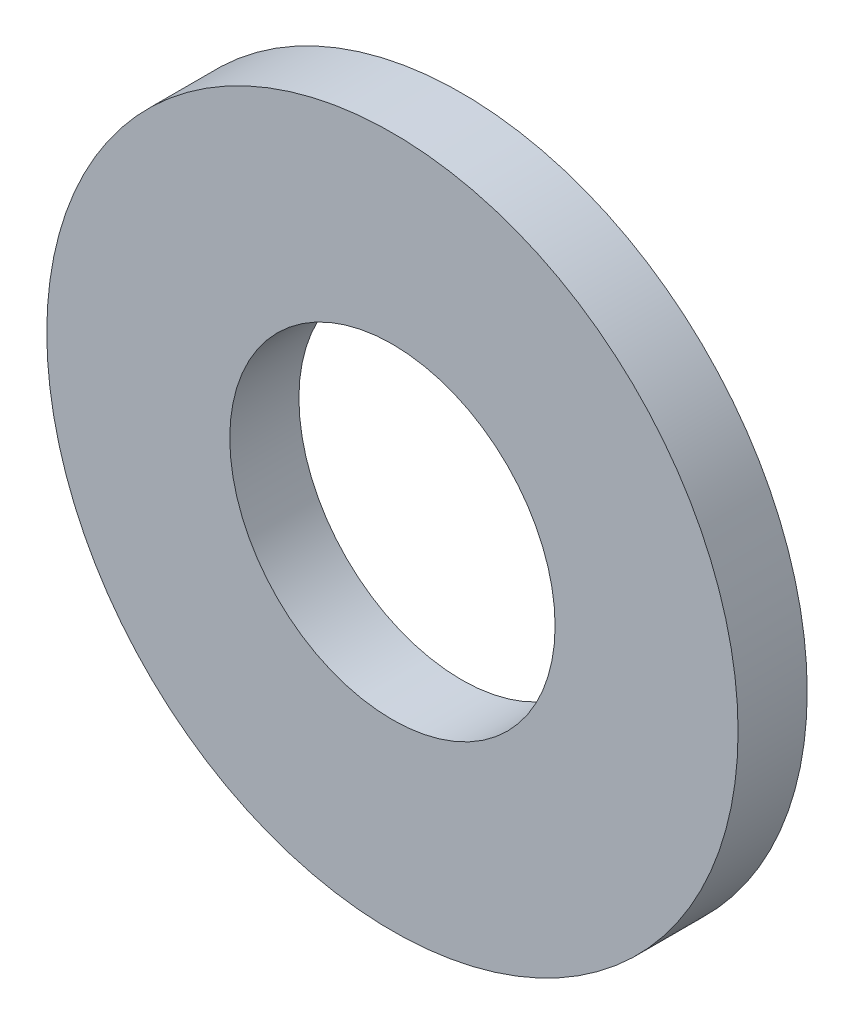
ISO-10303-21;
HEADER;
FILE_DESCRIPTION(('STEP AP214'),'2;1');
FILE_NAME('part.step','',(''),(''),'','','');
FILE_SCHEMA(('AUTOMOTIVE_DESIGN { 1 0 10303 214 1 1 1 1 }'));
ENDSEC;
DATA;
#1=APPLICATION_CONTEXT('core data for automotive mechanical design processes');
#2=APPLICATION_PROTOCOL_DEFINITION('international standard','automotive_design',2000,#1);
#3=PRODUCT_CONTEXT('',#1,'mechanical');
#4=PRODUCT('Part','Part','',(#3));
#5=PRODUCT_RELATED_PRODUCT_CATEGORY('part','',(#4));
#6=PRODUCT_DEFINITION_FORMATION('','',#4);
#7=PRODUCT_DEFINITION_CONTEXT('part definition',#1,'design');
#8=PRODUCT_DEFINITION('design','',#6,#7);
#9=PRODUCT_DEFINITION_SHAPE('','',#8);
#10=(LENGTH_UNIT() NAMED_UNIT(*) SI_UNIT(.MILLI.,.METRE.));
#11=(NAMED_UNIT(*) PLANE_ANGLE_UNIT() SI_UNIT($,.RADIAN.));
#12=(NAMED_UNIT(*) SI_UNIT($,.STERADIAN.) SOLID_ANGLE_UNIT());
#13=UNCERTAINTY_MEASURE_WITH_UNIT(LENGTH_MEASURE(1.E-05),#10,'distance_accuracy_value','');
#14=(GEOMETRIC_REPRESENTATION_CONTEXT(3) GLOBAL_UNCERTAINTY_ASSIGNED_CONTEXT((#13)) GLOBAL_UNIT_ASSIGNED_CONTEXT((#10,
#11,#12)) REPRESENTATION_CONTEXT('',''));
#15=CARTESIAN_POINT('',(0.,0.,0.));
#16=DIRECTION('',(0.,0.,1.));
#17=DIRECTION('',(1.,0.,0.));
#18=AXIS2_PLACEMENT_3D('',#15,#16,#17);
#19=CARTESIAN_POINT('',(0.,0.,1.7));
#20=DIRECTION('',(0.,0.,1.));
#21=DIRECTION('',(1.,0.,0.));
#22=AXIS2_PLACEMENT_3D('',#19,#20,#21);
#23=PLANE('',#22);
#24=CARTESIAN_POINT('',(0.,0.,1.7));
#25=DIRECTION('',(0.,0.,1.));
#26=DIRECTION('',(1.,0.,0.));
#27=AXIS2_PLACEMENT_3D('',#24,#25,#26);
#28=CIRCLE('',#27,8.5);
#29=CARTESIAN_POINT('',(8.5,0.,1.7));
#30=VERTEX_POINT('',#29);
#31=EDGE_CURVE('E10',#30,#30,#28,.T.);
#32=ORIENTED_EDGE('',*,*,#31,.T.);
#33=EDGE_LOOP('',(#32));
#34=FACE_BOUND('',#33,.T.);
#35=CARTESIAN_POINT('',(0.,0.,1.7));
#36=DIRECTION('',(0.,0.,1.));
#37=DIRECTION('',(1.,0.,0.));
#38=AXIS2_PLACEMENT_3D('',#35,#36,#37);
#39=CIRCLE('',#38,4.);
#40=CARTESIAN_POINT('',(4.,0.,1.7));
#41=VERTEX_POINT('',#40);
#42=EDGE_CURVE('E44',#41,#41,#39,.T.);
#43=ORIENTED_EDGE('',*,*,#42,.F.);
#44=EDGE_LOOP('',(#43));
#45=FACE_BOUND('',#44,.T.);
#46=ADVANCED_FACE('F33',(#34,#45),#23,.T.);
#47=CARTESIAN_POINT('',(0.,0.,0.));
#48=DIRECTION('',(0.,0.,1.));
#49=DIRECTION('',(1.,0.,0.));
#50=AXIS2_PLACEMENT_3D('',#47,#48,#49);
#51=PLANE('',#50);
#52=CARTESIAN_POINT('',(0.,0.,0.));
#53=DIRECTION('',(0.,0.,1.));
#54=DIRECTION('',(1.,0.,0.));
#55=AXIS2_PLACEMENT_3D('',#52,#53,#54);
#56=CIRCLE('',#55,8.5);
#57=CARTESIAN_POINT('',(8.5,0.,0.));
#58=VERTEX_POINT('',#57);
#59=EDGE_CURVE('E37',#58,#58,#56,.T.);
#60=ORIENTED_EDGE('',*,*,#59,.F.);
#61=EDGE_LOOP('',(#60));
#62=FACE_BOUND('',#61,.T.);
#63=CARTESIAN_POINT('',(0.,0.,0.));
#64=DIRECTION('',(0.,0.,1.));
#65=DIRECTION('',(1.,0.,0.));
#66=AXIS2_PLACEMENT_3D('',#63,#64,#65);
#67=CIRCLE('',#66,4.);
#68=CARTESIAN_POINT('',(4.,0.,0.));
#69=VERTEX_POINT('',#68);
#70=EDGE_CURVE('E46',#69,#69,#67,.T.);
#71=ORIENTED_EDGE('',*,*,#70,.T.);
#72=EDGE_LOOP('',(#71));
#73=FACE_BOUND('',#72,.T.);
#74=ADVANCED_FACE('F56',(#62,#73),#51,.F.);
#75=CARTESIAN_POINT('',(0.,0.,1.7));
#76=DIRECTION('',(0.,0.,-1.));
#77=DIRECTION('',(-1.,0.,0.));
#78=AXIS2_PLACEMENT_3D('',#75,#76,#77);
#79=CYLINDRICAL_SURFACE('',#78,8.5);
#80=ORIENTED_EDGE('',*,*,#31,.F.);
#81=EDGE_LOOP('',(#80));
#82=FACE_BOUND('',#81,.T.);
#83=ORIENTED_EDGE('',*,*,#59,.T.);
#84=EDGE_LOOP('',(#83));
#85=FACE_BOUND('',#84,.T.);
#86=ADVANCED_FACE('F35',(#82,#85),#79,.T.);
#87=CARTESIAN_POINT('',(0.,0.,1.7));
#88=DIRECTION('',(0.,0.,-1.));
#89=DIRECTION('',(-1.,0.,0.));
#90=AXIS2_PLACEMENT_3D('',#87,#88,#89);
#91=CYLINDRICAL_SURFACE('',#90,4.);
#92=ORIENTED_EDGE('',*,*,#42,.T.);
#93=EDGE_LOOP('',(#92));
#94=FACE_BOUND('',#93,.T.);
#95=ORIENTED_EDGE('',*,*,#70,.F.);
#96=EDGE_LOOP('',(#95));
#97=FACE_BOUND('',#96,.T.);
#98=ADVANCED_FACE('F52',(#94,#97),#91,.F.);
#99=CLOSED_SHELL('',(#46,#74,#86,#98));
#100=MANIFOLD_SOLID_BREP('B2',#99);
#101=ADVANCED_BREP_SHAPE_REPRESENTATION('',(#18,#100),#14);
#102=SHAPE_DEFINITION_REPRESENTATION(#9,#101);
ENDSEC;
END-ISO-10303-21;
